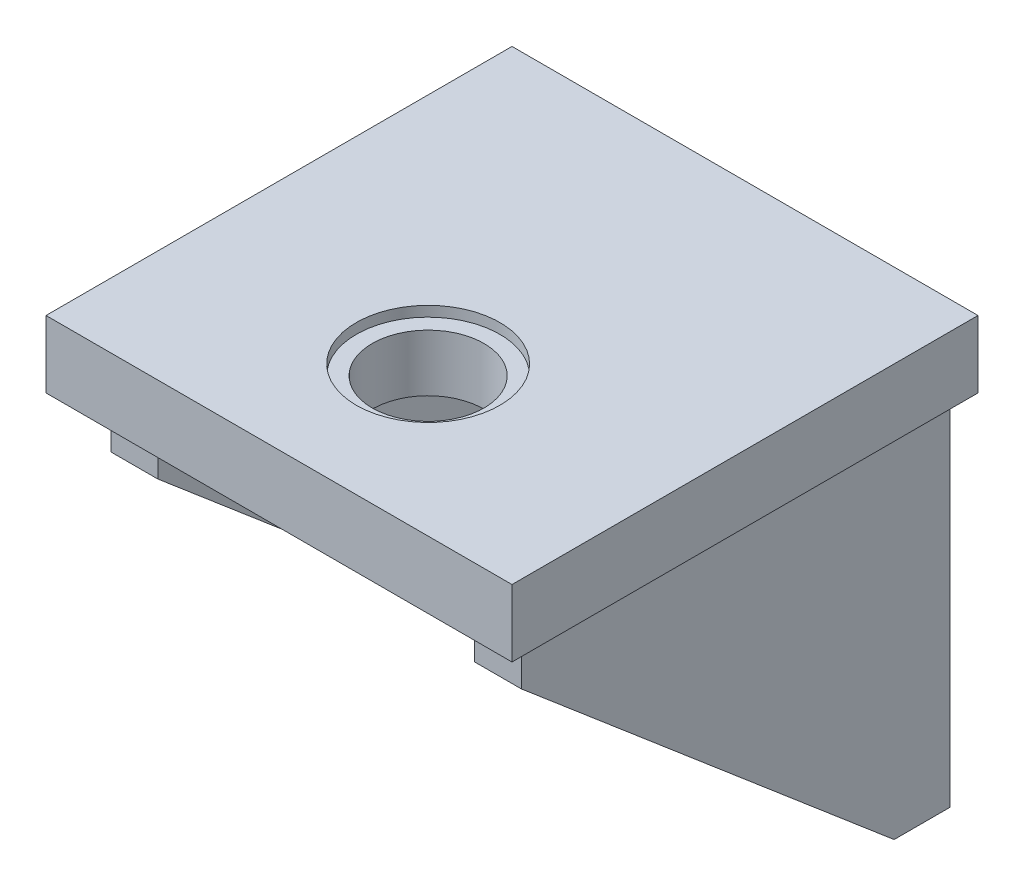
ISO-10303-21;
HEADER;
FILE_DESCRIPTION(('STEP AP214'),'2;1');
FILE_NAME('part.step','',(''),(''),'','','');
FILE_SCHEMA(('AUTOMOTIVE_DESIGN { 1 0 10303 214 1 1 1 1 }'));
ENDSEC;
DATA;
#1=APPLICATION_CONTEXT('core data for automotive mechanical design processes');
#2=APPLICATION_PROTOCOL_DEFINITION('international standard','automotive_design',2000,#1);
#3=PRODUCT_CONTEXT('',#1,'mechanical');
#4=PRODUCT('Part','Part','',(#3));
#5=PRODUCT_RELATED_PRODUCT_CATEGORY('part','',(#4));
#6=PRODUCT_DEFINITION_FORMATION('','',#4);
#7=PRODUCT_DEFINITION_CONTEXT('part definition',#1,'design');
#8=PRODUCT_DEFINITION('design','',#6,#7);
#9=PRODUCT_DEFINITION_SHAPE('','',#8);
#10=(LENGTH_UNIT() NAMED_UNIT(*) SI_UNIT(.MILLI.,.METRE.));
#11=(NAMED_UNIT(*) PLANE_ANGLE_UNIT() SI_UNIT($,.RADIAN.));
#12=(NAMED_UNIT(*) SI_UNIT($,.STERADIAN.) SOLID_ANGLE_UNIT());
#13=UNCERTAINTY_MEASURE_WITH_UNIT(LENGTH_MEASURE(1.E-05),#10,'distance_accuracy_value','');
#14=(GEOMETRIC_REPRESENTATION_CONTEXT(3) GLOBAL_UNCERTAINTY_ASSIGNED_CONTEXT((#13)) GLOBAL_UNIT_ASSIGNED_CONTEXT((#10,
#11,#12)) REPRESENTATION_CONTEXT('',''));
#15=CARTESIAN_POINT('',(0.,0.,0.));
#16=DIRECTION('',(0.,0.,1.));
#17=DIRECTION('',(1.,0.,0.));
#18=AXIS2_PLACEMENT_3D('',#15,#16,#17);
#19=CARTESIAN_POINT('',(235.,-200.,0.));
#20=DIRECTION('',(1.,0.,0.));
#21=DIRECTION('',(0.,0.,-1.));
#22=AXIS2_PLACEMENT_3D('',#19,#20,#21);
#23=PLANE('',#22);
#24=DIRECTION('',(0.,1.,0.));
#25=VECTOR('',#24,1.);
#26=CARTESIAN_POINT('',(235.,-200.,230.));
#27=LINE('',#26,#25);
#28=CARTESIAN_POINT('',(235.,-30.,230.));
#29=VERTEX_POINT('',#28);
#30=CARTESIAN_POINT('',(235.,0.,230.));
#31=VERTEX_POINT('',#30);
#32=EDGE_CURVE('E150',#29,#31,#27,.T.);
#33=ORIENTED_EDGE('',*,*,#32,.F.);
#34=DIRECTION('',(0.,-0.64764842009554,-0.761939317759459));
#35=VECTOR('',#34,1.);
#36=CARTESIAN_POINT('',(235.,-200.,30.));
#37=LINE('',#36,#35);
#38=CARTESIAN_POINT('',(235.,-200.,30.));
#39=VERTEX_POINT('',#38);
#40=EDGE_CURVE('E137',#29,#39,#37,.T.);
#41=ORIENTED_EDGE('',*,*,#40,.T.);
#42=DIRECTION('',(0.,0.,-1.));
#43=VECTOR('',#42,1.);
#44=CARTESIAN_POINT('',(235.,-200.,0.));
#45=LINE('',#44,#43);
#46=CARTESIAN_POINT('',(235.,-200.,0.));
#47=VERTEX_POINT('',#46);
#48=EDGE_CURVE('E147',#39,#47,#45,.T.);
#49=ORIENTED_EDGE('',*,*,#48,.T.);
#50=DIRECTION('',(0.,1.,0.));
#51=VECTOR('',#50,1.);
#52=CARTESIAN_POINT('',(235.,-200.,0.));
#53=LINE('',#52,#51);
#54=CARTESIAN_POINT('',(235.,0.,0.));
#55=VERTEX_POINT('',#54);
#56=EDGE_CURVE('E164',#47,#55,#53,.T.);
#57=ORIENTED_EDGE('',*,*,#56,.T.);
#58=DIRECTION('',(0.,0.,-1.));
#59=VECTOR('',#58,1.);
#60=CARTESIAN_POINT('',(235.,0.,0.));
#61=LINE('',#60,#59);
#62=EDGE_CURVE('E165',#31,#55,#61,.T.);
#63=ORIENTED_EDGE('',*,*,#62,.F.);
#64=EDGE_LOOP('',(#33,#41,#49,#57,#63));
#65=FACE_BOUND('',#64,.T.);
#66=ADVANCED_FACE('F35',(#65),#23,.T.);
#67=CARTESIAN_POINT('',(235.,-200.,230.));
#68=DIRECTION('',(0.,0.,1.));
#69=DIRECTION('',(1.,0.,0.));
#70=AXIS2_PLACEMENT_3D('',#67,#68,#69);
#71=PLANE('',#70);
#72=DIRECTION('',(0.,1.,0.));
#73=VECTOR('',#72,1.);
#74=CARTESIAN_POINT('',(210.,-200.,230.));
#75=LINE('',#74,#73);
#76=CARTESIAN_POINT('',(210.,-30.,230.));
#77=VERTEX_POINT('',#76);
#78=CARTESIAN_POINT('',(210.,0.,230.));
#79=VERTEX_POINT('',#78);
#80=EDGE_CURVE('E173',#77,#79,#75,.T.);
#81=ORIENTED_EDGE('',*,*,#80,.F.);
#82=DIRECTION('',(1.,0.,0.));
#83=VECTOR('',#82,1.);
#84=CARTESIAN_POINT('',(-0.001000000000001,-30.,230.));
#85=LINE('',#84,#83);
#86=EDGE_CURVE('E143',#77,#29,#85,.T.);
#87=ORIENTED_EDGE('',*,*,#86,.T.);
#88=ORIENTED_EDGE('',*,*,#32,.T.);
#89=DIRECTION('',(1.,0.,0.));
#90=VECTOR('',#89,1.);
#91=CARTESIAN_POINT('',(235.,0.,230.));
#92=LINE('',#91,#90);
#93=EDGE_CURVE('E159',#79,#31,#92,.T.);
#94=ORIENTED_EDGE('',*,*,#93,.F.);
#95=EDGE_LOOP('',(#81,#87,#88,#94));
#96=FACE_BOUND('',#95,.T.);
#97=ADVANCED_FACE('F292',(#96),#71,.T.);
#98=CARTESIAN_POINT('',(210.,-200.,0.));
#99=DIRECTION('',(-1.,0.,0.));
#100=DIRECTION('',(0.,0.,1.));
#101=AXIS2_PLACEMENT_3D('',#98,#99,#100);
#102=PLANE('',#101);
#103=DIRECTION('',(0.,0.,1.));
#104=VECTOR('',#103,1.);
#105=CARTESIAN_POINT('',(210.,-200.,0.));
#106=LINE('',#105,#104);
#107=CARTESIAN_POINT('',(210.,-200.,0.));
#108=VERTEX_POINT('',#107);
#109=CARTESIAN_POINT('',(210.,-200.,30.));
#110=VERTEX_POINT('',#109);
#111=EDGE_CURVE('E156',#108,#110,#106,.T.);
#112=ORIENTED_EDGE('',*,*,#111,.T.);
#113=DIRECTION('',(0.,-0.64764842009554,-0.761939317759459));
#114=VECTOR('',#113,1.);
#115=CARTESIAN_POINT('',(210.,-200.,30.));
#116=LINE('',#115,#114);
#117=EDGE_CURVE('E51',#77,#110,#116,.T.);
#118=ORIENTED_EDGE('',*,*,#117,.F.);
#119=ORIENTED_EDGE('',*,*,#80,.T.);
#120=DIRECTION('',(0.,0.,1.));
#121=VECTOR('',#120,1.);
#122=CARTESIAN_POINT('',(210.,0.,0.));
#123=LINE('',#122,#121);
#124=CARTESIAN_POINT('',(210.,0.,0.));
#125=VERTEX_POINT('',#124);
#126=EDGE_CURVE('E59',#125,#79,#123,.T.);
#127=ORIENTED_EDGE('',*,*,#126,.F.);
#128=DIRECTION('',(0.,1.,0.));
#129=VECTOR('',#128,1.);
#130=CARTESIAN_POINT('',(210.,-200.,0.));
#131=LINE('',#130,#129);
#132=EDGE_CURVE('E171',#108,#125,#131,.T.);
#133=ORIENTED_EDGE('',*,*,#132,.F.);
#134=EDGE_LOOP('',(#112,#118,#119,#127,#133));
#135=FACE_BOUND('',#134,.T.);
#136=ADVANCED_FACE('F294',(#135),#102,.T.);
#137=CARTESIAN_POINT('',(250.,-200.,0.));
#138=DIRECTION('',(0.,1.,0.));
#139=DIRECTION('',(0.,0.,1.));
#140=AXIS2_PLACEMENT_3D('',#137,#138,#139);
#141=PLANE('',#140);
#142=DIRECTION('',(1.,0.,0.));
#143=VECTOR('',#142,1.);
#144=CARTESIAN_POINT('',(-0.001000000000001,-200.,30.));
#145=LINE('',#144,#143);
#146=EDGE_CURVE('E134',#110,#39,#145,.T.);
#147=ORIENTED_EDGE('',*,*,#146,.F.);
#148=ORIENTED_EDGE('',*,*,#111,.F.);
#149=DIRECTION('',(-1.,0.,0.));
#150=VECTOR('',#149,1.);
#151=CARTESIAN_POINT('',(235.,-200.,0.));
#152=LINE('',#151,#150);
#153=EDGE_CURVE('E155',#47,#108,#152,.T.);
#154=ORIENTED_EDGE('',*,*,#153,.F.);
#155=ORIENTED_EDGE('',*,*,#48,.F.);
#156=EDGE_LOOP('',(#147,#148,#154,#155));
#157=FACE_BOUND('',#156,.T.);
#158=ADVANCED_FACE('F153',(#157),#141,.F.);
#159=CARTESIAN_POINT('',(0.,0.,0.));
#160=DIRECTION('',(0.,1.,0.));
#161=DIRECTION('',(0.,0.,1.));
#162=AXIS2_PLACEMENT_3D('',#159,#160,#161);
#163=PLANE('',#162);
#164=CARTESIAN_POINT('',(125.,0.,170.));
#165=DIRECTION('',(0.,1.,0.));
#166=DIRECTION('',(0.,0.,1.));
#167=AXIS2_PLACEMENT_3D('',#164,#165,#166);
#168=CIRCLE('',#167,30.);
#169=CARTESIAN_POINT('',(125.,0.,200.));
#170=VERTEX_POINT('',#169);
#171=EDGE_CURVE('E217',#170,#170,#168,.F.);
#172=ORIENTED_EDGE('',*,*,#171,.F.);
#173=EDGE_LOOP('',(#172));
#174=FACE_BOUND('',#173,.T.);
#175=ORIENTED_EDGE('',*,*,#93,.T.);
#176=ORIENTED_EDGE('',*,*,#62,.T.);
#177=DIRECTION('',(-1.,0.,0.));
#178=VECTOR('',#177,1.);
#179=CARTESIAN_POINT('',(0.,0.,0.));
#180=LINE('',#179,#178);
#181=CARTESIAN_POINT('',(250.,0.,0.));
#182=VERTEX_POINT('',#181);
#183=EDGE_CURVE('E225',#182,#55,#180,.T.);
#184=ORIENTED_EDGE('',*,*,#183,.F.);
#185=DIRECTION('',(0.,0.,-1.));
#186=VECTOR('',#185,1.);
#187=CARTESIAN_POINT('',(250.,0.,0.));
#188=LINE('',#187,#186);
#189=CARTESIAN_POINT('',(250.,0.,250.));
#190=VERTEX_POINT('',#189);
#191=EDGE_CURVE('E236',#190,#182,#188,.T.);
#192=ORIENTED_EDGE('',*,*,#191,.F.);
#193=DIRECTION('',(1.,0.,0.));
#194=VECTOR('',#193,1.);
#195=CARTESIAN_POINT('',(0.,0.,250.));
#196=LINE('',#195,#194);
#197=CARTESIAN_POINT('',(0.,0.,250.));
#198=VERTEX_POINT('',#197);
#199=EDGE_CURVE('E234',#198,#190,#196,.T.);
#200=ORIENTED_EDGE('',*,*,#199,.F.);
#201=DIRECTION('',(0.,0.,1.));
#202=VECTOR('',#201,1.);
#203=CARTESIAN_POINT('',(0.,0.,0.));
#204=LINE('',#203,#202);
#205=CARTESIAN_POINT('',(0.,0.,0.));
#206=VERTEX_POINT('',#205);
#207=EDGE_CURVE('E220',#206,#198,#204,.T.);
#208=ORIENTED_EDGE('',*,*,#207,.F.);
#209=CARTESIAN_POINT('',(15.,0.,0.));
#210=VERTEX_POINT('',#209);
#211=EDGE_CURVE('E238',#210,#206,#180,.T.);
#212=ORIENTED_EDGE('',*,*,#211,.F.);
#213=DIRECTION('',(0.,0.,-1.));
#214=VECTOR('',#213,1.);
#215=CARTESIAN_POINT('',(15.,0.,0.));
#216=LINE('',#215,#214);
#217=CARTESIAN_POINT('',(15.,0.,230.));
#218=VERTEX_POINT('',#217);
#219=EDGE_CURVE('E184',#218,#210,#216,.T.);
#220=ORIENTED_EDGE('',*,*,#219,.F.);
#221=DIRECTION('',(-1.,0.,0.));
#222=VECTOR('',#221,1.);
#223=CARTESIAN_POINT('',(15.,0.,230.));
#224=LINE('',#223,#222);
#225=CARTESIAN_POINT('',(40.,0.,230.));
#226=VERTEX_POINT('',#225);
#227=EDGE_CURVE('E189',#226,#218,#224,.T.);
#228=ORIENTED_EDGE('',*,*,#227,.F.);
#229=DIRECTION('',(0.,0.,1.));
#230=VECTOR('',#229,1.);
#231=CARTESIAN_POINT('',(40.,0.,0.));
#232=LINE('',#231,#230);
#233=CARTESIAN_POINT('',(40.,0.,0.));
#234=VERTEX_POINT('',#233);
#235=EDGE_CURVE('E197',#234,#226,#232,.T.);
#236=ORIENTED_EDGE('',*,*,#235,.F.);
#237=EDGE_CURVE('E241',#125,#234,#180,.T.);
#238=ORIENTED_EDGE('',*,*,#237,.F.);
#239=ORIENTED_EDGE('',*,*,#126,.T.);
#240=EDGE_LOOP('',(#175,#176,#184,#192,#200,#208,#212,#220,#228,#236,#238,#239));
#241=FACE_BOUND('',#240,.T.);
#242=ADVANCED_FACE('F257',(#174,#241),#163,.F.);
#243=CARTESIAN_POINT('',(125.,-0.001000000000001,170.));
#244=DIRECTION('',(0.,1.,0.));
#245=DIRECTION('',(0.,0.,1.));
#246=AXIS2_PLACEMENT_3D('',#243,#244,#245);
#247=CYLINDRICAL_SURFACE('',#246,30.);
#248=ORIENTED_EDGE('',*,*,#171,.T.);
#249=EDGE_LOOP('',(#248));
#250=FACE_BOUND('',#249,.T.);
#251=CARTESIAN_POINT('',(125.,30.5,170.));
#252=DIRECTION('',(0.,1.,0.));
#253=DIRECTION('',(0.,0.,1.));
#254=AXIS2_PLACEMENT_3D('',#251,#252,#253);
#255=CIRCLE('',#254,30.);
#256=CARTESIAN_POINT('',(125.,30.5,200.));
#257=VERTEX_POINT('',#256);
#258=EDGE_CURVE('E39',#257,#257,#255,.F.);
#259=ORIENTED_EDGE('',*,*,#258,.F.);
#260=EDGE_LOOP('',(#259));
#261=FACE_BOUND('',#260,.T.);
#262=ADVANCED_FACE('F330',(#250,#261),#247,.F.);
#263=CARTESIAN_POINT('',(0.,36.,0.));
#264=DIRECTION('',(1.,0.,0.));
#265=DIRECTION('',(0.,0.,-1.));
#266=AXIS2_PLACEMENT_3D('',#263,#264,#265);
#267=PLANE('',#266);
#268=ORIENTED_EDGE('',*,*,#207,.T.);
#269=DIRECTION('',(0.,-1.,0.));
#270=VECTOR('',#269,1.);
#271=CARTESIAN_POINT('',(0.,36.,250.));
#272=LINE('',#271,#270);
#273=CARTESIAN_POINT('',(0.,36.,250.));
#274=VERTEX_POINT('',#273);
#275=EDGE_CURVE('E11',#274,#198,#272,.T.);
#276=ORIENTED_EDGE('',*,*,#275,.F.);
#277=DIRECTION('',(0.,0.,1.));
#278=VECTOR('',#277,1.);
#279=CARTESIAN_POINT('',(0.,36.,0.));
#280=LINE('',#279,#278);
#281=CARTESIAN_POINT('',(0.,36.,0.));
#282=VERTEX_POINT('',#281);
#283=EDGE_CURVE('E221',#282,#274,#280,.T.);
#284=ORIENTED_EDGE('',*,*,#283,.F.);
#285=DIRECTION('',(0.,-1.,0.));
#286=VECTOR('',#285,1.);
#287=CARTESIAN_POINT('',(0.,36.,0.));
#288=LINE('',#287,#286);
#289=EDGE_CURVE('E231',#282,#206,#288,.T.);
#290=ORIENTED_EDGE('',*,*,#289,.T.);
#291=EDGE_LOOP('',(#268,#276,#284,#290));
#292=FACE_BOUND('',#291,.T.);
#293=ADVANCED_FACE('F37',(#292),#267,.F.);
#294=CARTESIAN_POINT('',(0.,36.,250.));
#295=DIRECTION('',(0.,0.,-1.));
#296=DIRECTION('',(-1.,0.,0.));
#297=AXIS2_PLACEMENT_3D('',#294,#295,#296);
#298=PLANE('',#297);
#299=ORIENTED_EDGE('',*,*,#199,.T.);
#300=DIRECTION('',(0.,-1.,0.));
#301=VECTOR('',#300,1.);
#302=CARTESIAN_POINT('',(250.,36.,250.));
#303=LINE('',#302,#301);
#304=CARTESIAN_POINT('',(250.,36.,250.));
#305=VERTEX_POINT('',#304);
#306=EDGE_CURVE('E44',#305,#190,#303,.T.);
#307=ORIENTED_EDGE('',*,*,#306,.F.);
#308=DIRECTION('',(1.,0.,0.));
#309=VECTOR('',#308,1.);
#310=CARTESIAN_POINT('',(0.,36.,250.));
#311=LINE('',#310,#309);
#312=EDGE_CURVE('E224',#274,#305,#311,.T.);
#313=ORIENTED_EDGE('',*,*,#312,.F.);
#314=ORIENTED_EDGE('',*,*,#275,.T.);
#315=EDGE_LOOP('',(#299,#307,#313,#314));
#316=FACE_BOUND('',#315,.T.);
#317=ADVANCED_FACE('F267',(#316),#298,.F.);
#318=CARTESIAN_POINT('',(250.,36.,0.));
#319=DIRECTION('',(-1.,0.,0.));
#320=DIRECTION('',(0.,0.,1.));
#321=AXIS2_PLACEMENT_3D('',#318,#319,#320);
#322=PLANE('',#321);
#323=ORIENTED_EDGE('',*,*,#191,.T.);
#324=DIRECTION('',(0.,-1.,0.));
#325=VECTOR('',#324,1.);
#326=CARTESIAN_POINT('',(250.,36.,0.));
#327=LINE('',#326,#325);
#328=CARTESIAN_POINT('',(250.,36.,0.));
#329=VERTEX_POINT('',#328);
#330=EDGE_CURVE('E244',#329,#182,#327,.T.);
#331=ORIENTED_EDGE('',*,*,#330,.F.);
#332=DIRECTION('',(0.,0.,-1.));
#333=VECTOR('',#332,1.);
#334=CARTESIAN_POINT('',(250.,36.,0.));
#335=LINE('',#334,#333);
#336=EDGE_CURVE('E227',#305,#329,#335,.T.);
#337=ORIENTED_EDGE('',*,*,#336,.F.);
#338=ORIENTED_EDGE('',*,*,#306,.T.);
#339=EDGE_LOOP('',(#323,#331,#337,#338));
#340=FACE_BOUND('',#339,.T.);
#341=ADVANCED_FACE('F252',(#340),#322,.F.);
#342=CARTESIAN_POINT('',(0.,36.,0.));
#343=DIRECTION('',(0.,0.,1.));
#344=DIRECTION('',(1.,0.,0.));
#345=AXIS2_PLACEMENT_3D('',#342,#343,#344);
#346=PLANE('',#345);
#347=ORIENTED_EDGE('',*,*,#183,.T.);
#348=ORIENTED_EDGE('',*,*,#56,.F.);
#349=ORIENTED_EDGE('',*,*,#153,.T.);
#350=ORIENTED_EDGE('',*,*,#132,.T.);
#351=ORIENTED_EDGE('',*,*,#237,.T.);
#352=DIRECTION('',(0.,1.,0.));
#353=VECTOR('',#352,1.);
#354=CARTESIAN_POINT('',(40.,-200.,0.));
#355=LINE('',#354,#353);
#356=CARTESIAN_POINT('',(40.,-200.,0.));
#357=VERTEX_POINT('',#356);
#358=EDGE_CURVE('E205',#357,#234,#355,.T.);
#359=ORIENTED_EDGE('',*,*,#358,.F.);
#360=DIRECTION('',(1.,0.,0.));
#361=VECTOR('',#360,1.);
#362=CARTESIAN_POINT('',(15.,-200.,0.));
#363=LINE('',#362,#361);
#364=CARTESIAN_POINT('',(15.,-200.,0.));
#365=VERTEX_POINT('',#364);
#366=EDGE_CURVE('E188',#365,#357,#363,.T.);
#367=ORIENTED_EDGE('',*,*,#366,.F.);
#368=DIRECTION('',(0.,1.,0.));
#369=VECTOR('',#368,1.);
#370=CARTESIAN_POINT('',(15.,-200.,0.));
#371=LINE('',#370,#369);
#372=EDGE_CURVE('E208',#365,#210,#371,.T.);
#373=ORIENTED_EDGE('',*,*,#372,.T.);
#374=ORIENTED_EDGE('',*,*,#211,.T.);
#375=ORIENTED_EDGE('',*,*,#289,.F.);
#376=DIRECTION('',(-1.,0.,0.));
#377=VECTOR('',#376,1.);
#378=CARTESIAN_POINT('',(0.,36.,0.));
#379=LINE('',#378,#377);
#380=EDGE_CURVE('E229',#329,#282,#379,.T.);
#381=ORIENTED_EDGE('',*,*,#380,.F.);
#382=ORIENTED_EDGE('',*,*,#330,.T.);
#383=EDGE_LOOP('',(#347,#348,#349,#350,#351,#359,#367,#373,#374,#375,#381,#382));
#384=FACE_BOUND('',#383,.T.);
#385=ADVANCED_FACE('F260',(#384),#346,.F.);
#386=CARTESIAN_POINT('',(0.,36.,0.));
#387=DIRECTION('',(0.,1.,0.));
#388=DIRECTION('',(0.,0.,1.));
#389=AXIS2_PLACEMENT_3D('',#386,#387,#388);
#390=PLANE('',#389);
#391=CARTESIAN_POINT('',(125.,36.,170.));
#392=DIRECTION('',(0.,1.,0.));
#393=DIRECTION('',(0.,0.,1.));
#394=AXIS2_PLACEMENT_3D('',#391,#392,#393);
#395=CIRCLE('',#394,38.5);
#396=CARTESIAN_POINT('',(125.,36.,208.5));
#397=VERTEX_POINT('',#396);
#398=EDGE_CURVE('E211',#397,#397,#395,.T.);
#399=ORIENTED_EDGE('',*,*,#398,.F.);
#400=EDGE_LOOP('',(#399));
#401=FACE_BOUND('',#400,.T.);
#402=ORIENTED_EDGE('',*,*,#283,.T.);
#403=ORIENTED_EDGE('',*,*,#312,.T.);
#404=ORIENTED_EDGE('',*,*,#336,.T.);
#405=ORIENTED_EDGE('',*,*,#380,.T.);
#406=EDGE_LOOP('',(#402,#403,#404,#405));
#407=FACE_BOUND('',#406,.T.);
#408=ADVANCED_FACE('F265',(#401,#407),#390,.T.);
#409=CARTESIAN_POINT('',(125.,30.5,170.));
#410=DIRECTION('',(0.,1.,0.));
#411=DIRECTION('',(0.,0.,1.));
#412=AXIS2_PLACEMENT_3D('',#409,#410,#411);
#413=PLANE('',#412);
#414=CARTESIAN_POINT('',(125.,30.5,170.));
#415=DIRECTION('',(0.,1.,0.));
#416=DIRECTION('',(0.,0.,1.));
#417=AXIS2_PLACEMENT_3D('',#414,#415,#416);
#418=CIRCLE('',#417,38.5);
#419=CARTESIAN_POINT('',(125.,30.5,208.5));
#420=VERTEX_POINT('',#419);
#421=EDGE_CURVE('E212',#420,#420,#418,.T.);
#422=ORIENTED_EDGE('',*,*,#421,.T.);
#423=EDGE_LOOP('',(#422));
#424=FACE_BOUND('',#423,.T.);
#425=ORIENTED_EDGE('',*,*,#258,.T.);
#426=EDGE_LOOP('',(#425));
#427=FACE_BOUND('',#426,.T.);
#428=ADVANCED_FACE('F323',(#424,#427),#413,.T.);
#429=CARTESIAN_POINT('',(125.,30.5,170.));
#430=DIRECTION('',(0.,1.,0.));
#431=DIRECTION('',(0.,0.,1.));
#432=AXIS2_PLACEMENT_3D('',#429,#430,#431);
#433=CYLINDRICAL_SURFACE('',#432,38.5);
#434=ORIENTED_EDGE('',*,*,#421,.F.);
#435=EDGE_LOOP('',(#434));
#436=FACE_BOUND('',#435,.T.);
#437=ORIENTED_EDGE('',*,*,#398,.T.);
#438=EDGE_LOOP('',(#437));
#439=FACE_BOUND('',#438,.T.);
#440=ADVANCED_FACE('F322',(#436,#439),#433,.F.);
#441=CARTESIAN_POINT('',(15.,-200.,0.));
#442=DIRECTION('',(1.,0.,0.));
#443=DIRECTION('',(0.,0.,-1.));
#444=AXIS2_PLACEMENT_3D('',#441,#442,#443);
#445=PLANE('',#444);
#446=DIRECTION('',(0.,0.,-1.));
#447=VECTOR('',#446,1.);
#448=CARTESIAN_POINT('',(15.,-200.,0.));
#449=LINE('',#448,#447);
#450=CARTESIAN_POINT('',(15.,-200.,30.));
#451=VERTEX_POINT('',#450);
#452=EDGE_CURVE('E186',#451,#365,#449,.T.);
#453=ORIENTED_EDGE('',*,*,#452,.F.);
#454=DIRECTION('',(0.,-0.64764842009554,-0.761939317759459));
#455=VECTOR('',#454,1.);
#456=CARTESIAN_POINT('',(15.,-200.,30.));
#457=LINE('',#456,#455);
#458=CARTESIAN_POINT('',(15.,-30.,230.));
#459=VERTEX_POINT('',#458);
#460=EDGE_CURVE('E178',#459,#451,#457,.T.);
#461=ORIENTED_EDGE('',*,*,#460,.F.);
#462=DIRECTION('',(0.,1.,0.));
#463=VECTOR('',#462,1.);
#464=CARTESIAN_POINT('',(15.,-200.,230.));
#465=LINE('',#464,#463);
#466=EDGE_CURVE('E194',#459,#218,#465,.T.);
#467=ORIENTED_EDGE('',*,*,#466,.T.);
#468=ORIENTED_EDGE('',*,*,#219,.T.);
#469=ORIENTED_EDGE('',*,*,#372,.F.);
#470=EDGE_LOOP('',(#453,#461,#467,#468,#469));
#471=FACE_BOUND('',#470,.T.);
#472=ADVANCED_FACE('F276',(#471),#445,.F.);
#473=CARTESIAN_POINT('',(40.,-200.,0.));
#474=DIRECTION('',(-1.,0.,0.));
#475=DIRECTION('',(0.,0.,1.));
#476=AXIS2_PLACEMENT_3D('',#473,#474,#475);
#477=PLANE('',#476);
#478=DIRECTION('',(0.,1.,0.));
#479=VECTOR('',#478,1.);
#480=CARTESIAN_POINT('',(40.,-200.,230.));
#481=LINE('',#480,#479);
#482=CARTESIAN_POINT('',(40.,-30.,230.));
#483=VERTEX_POINT('',#482);
#484=EDGE_CURVE('E203',#483,#226,#481,.T.);
#485=ORIENTED_EDGE('',*,*,#484,.F.);
#486=DIRECTION('',(0.,0.647648420095541,0.761939317759459));
#487=VECTOR('',#486,1.);
#488=CARTESIAN_POINT('',(40.,-200.,30.));
#489=LINE('',#488,#487);
#490=CARTESIAN_POINT('',(40.,-200.,30.));
#491=VERTEX_POINT('',#490);
#492=EDGE_CURVE('E176',#491,#483,#489,.T.);
#493=ORIENTED_EDGE('',*,*,#492,.F.);
#494=DIRECTION('',(0.,0.,1.));
#495=VECTOR('',#494,1.);
#496=CARTESIAN_POINT('',(40.,-200.,0.));
#497=LINE('',#496,#495);
#498=EDGE_CURVE('E191',#357,#491,#497,.T.);
#499=ORIENTED_EDGE('',*,*,#498,.F.);
#500=ORIENTED_EDGE('',*,*,#358,.T.);
#501=ORIENTED_EDGE('',*,*,#235,.T.);
#502=EDGE_LOOP('',(#485,#493,#499,#500,#501));
#503=FACE_BOUND('',#502,.T.);
#504=ADVANCED_FACE('F286',(#503),#477,.F.);
#505=CARTESIAN_POINT('',(15.,-200.,230.));
#506=DIRECTION('',(0.,0.,-1.));
#507=DIRECTION('',(-1.,0.,0.));
#508=AXIS2_PLACEMENT_3D('',#505,#506,#507);
#509=PLANE('',#508);
#510=ORIENTED_EDGE('',*,*,#466,.F.);
#511=DIRECTION('',(-1.,0.,0.));
#512=VECTOR('',#511,1.);
#513=CARTESIAN_POINT('',(250.001,-30.,230.));
#514=LINE('',#513,#512);
#515=EDGE_CURVE('E180',#483,#459,#514,.T.);
#516=ORIENTED_EDGE('',*,*,#515,.F.);
#517=ORIENTED_EDGE('',*,*,#484,.T.);
#518=ORIENTED_EDGE('',*,*,#227,.T.);
#519=EDGE_LOOP('',(#510,#516,#517,#518));
#520=FACE_BOUND('',#519,.T.);
#521=ADVANCED_FACE('F281',(#520),#509,.F.);
#522=CARTESIAN_POINT('',(0.,-200.,0.));
#523=DIRECTION('',(0.,1.,0.));
#524=DIRECTION('',(0.,0.,1.));
#525=AXIS2_PLACEMENT_3D('',#522,#523,#524);
#526=PLANE('',#525);
#527=ORIENTED_EDGE('',*,*,#498,.T.);
#528=DIRECTION('',(-1.,0.,0.));
#529=VECTOR('',#528,1.);
#530=CARTESIAN_POINT('',(250.001,-200.,30.));
#531=LINE('',#530,#529);
#532=EDGE_CURVE('E181',#491,#451,#531,.T.);
#533=ORIENTED_EDGE('',*,*,#532,.T.);
#534=ORIENTED_EDGE('',*,*,#452,.T.);
#535=ORIENTED_EDGE('',*,*,#366,.T.);
#536=EDGE_LOOP('',(#527,#533,#534,#535));
#537=FACE_BOUND('',#536,.T.);
#538=ADVANCED_FACE('F311',(#537),#526,.F.);
#539=CARTESIAN_POINT('',(250.001,-200.,30.));
#540=DIRECTION('',(0.,0.761939317759459,-0.647648420095541));
#541=DIRECTION('',(0.,0.647648420095541,0.761939317759459));
#542=AXIS2_PLACEMENT_3D('',#539,#540,#541);
#543=PLANE('',#542);
#544=ORIENTED_EDGE('',*,*,#492,.T.);
#545=ORIENTED_EDGE('',*,*,#515,.T.);
#546=ORIENTED_EDGE('',*,*,#460,.T.);
#547=ORIENTED_EDGE('',*,*,#532,.F.);
#548=EDGE_LOOP('',(#544,#545,#546,#547));
#549=FACE_BOUND('',#548,.T.);
#550=ADVANCED_FACE('F308',(#549),#543,.F.);
#551=CARTESIAN_POINT('',(-0.001000000000001,-200.,30.));
#552=DIRECTION('',(0.,-0.761939317759459,0.647648420095541));
#553=DIRECTION('',(0.,-0.64764842009554,-0.761939317759459));
#554=AXIS2_PLACEMENT_3D('',#551,#552,#553);
#555=PLANE('',#554);
#556=ORIENTED_EDGE('',*,*,#117,.T.);
#557=ORIENTED_EDGE('',*,*,#146,.T.);
#558=ORIENTED_EDGE('',*,*,#40,.F.);
#559=ORIENTED_EDGE('',*,*,#86,.F.);
#560=EDGE_LOOP('',(#556,#557,#558,#559));
#561=FACE_BOUND('',#560,.T.);
#562=ADVANCED_FACE('F136',(#561),#555,.T.);
#563=CLOSED_SHELL('',(#66,#97,#136,#158,#242,#262,#293,#317,#341,#385,#408,#428,#440,#472,#504,
#521,#538,#550,#562));
#564=MANIFOLD_SOLID_BREP('B2',#563);
#565=ADVANCED_BREP_SHAPE_REPRESENTATION('',(#18,#564),#14);
#566=SHAPE_DEFINITION_REPRESENTATION(#9,#565);
ENDSEC;
END-ISO-10303-21;
